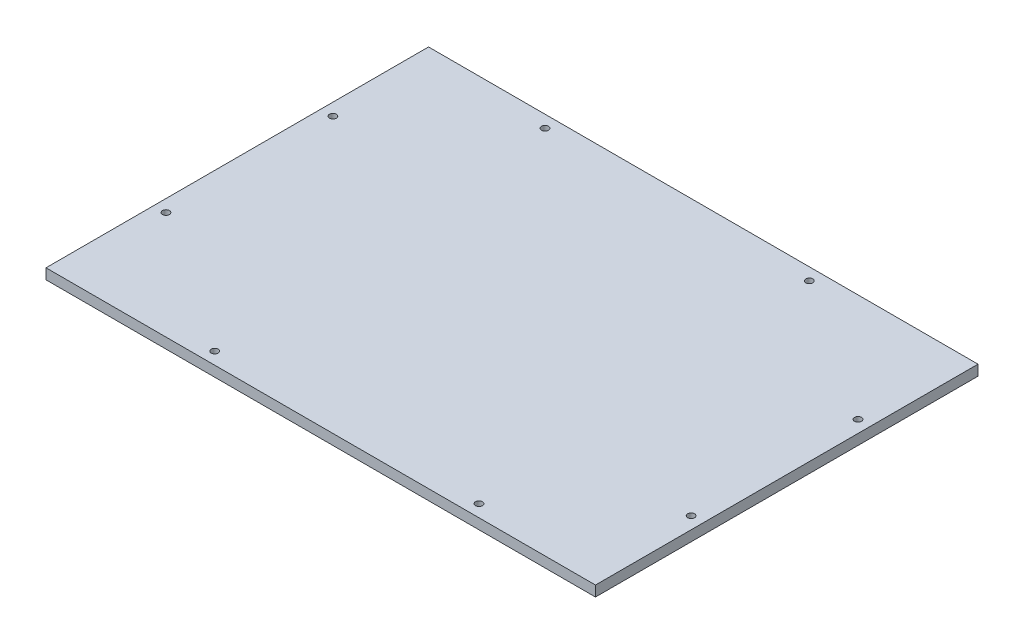
ISO-10303-21;
HEADER;
FILE_DESCRIPTION(('STEP AP214'),'2;1');
FILE_NAME('part.step','',(''),(''),'','','');
FILE_SCHEMA(('AUTOMOTIVE_DESIGN { 1 0 10303 214 1 1 1 1 }'));
ENDSEC;
DATA;
#1=APPLICATION_CONTEXT('core data for automotive mechanical design processes');
#2=APPLICATION_PROTOCOL_DEFINITION('international standard','automotive_design',2000,#1);
#3=PRODUCT_CONTEXT('',#1,'mechanical');
#4=PRODUCT('Part','Part','',(#3));
#5=PRODUCT_RELATED_PRODUCT_CATEGORY('part','',(#4));
#6=PRODUCT_DEFINITION_FORMATION('','',#4);
#7=PRODUCT_DEFINITION_CONTEXT('part definition',#1,'design');
#8=PRODUCT_DEFINITION('design','',#6,#7);
#9=PRODUCT_DEFINITION_SHAPE('','',#8);
#10=(LENGTH_UNIT() NAMED_UNIT(*) SI_UNIT(.MILLI.,.METRE.));
#11=(NAMED_UNIT(*) PLANE_ANGLE_UNIT() SI_UNIT($,.RADIAN.));
#12=(NAMED_UNIT(*) SI_UNIT($,.STERADIAN.) SOLID_ANGLE_UNIT());
#13=UNCERTAINTY_MEASURE_WITH_UNIT(LENGTH_MEASURE(1.E-05),#10,'distance_accuracy_value','');
#14=(GEOMETRIC_REPRESENTATION_CONTEXT(3) GLOBAL_UNCERTAINTY_ASSIGNED_CONTEXT((#13)) GLOBAL_UNIT_ASSIGNED_CONTEXT((#10,
#11,#12)) REPRESENTATION_CONTEXT('',''));
#15=CARTESIAN_POINT('',(0.,0.,0.));
#16=DIRECTION('',(0.,0.,1.));
#17=DIRECTION('',(1.,0.,0.));
#18=AXIS2_PLACEMENT_3D('',#15,#16,#17);
#19=CARTESIAN_POINT('',(8.4882527000098,9.525,0.));
#20=DIRECTION('',(1.,0.,0.));
#21=DIRECTION('',(0.,0.,-1.));
#22=AXIS2_PLACEMENT_3D('',#19,#20,#21);
#23=PLANE('',#22);
#24=DIRECTION('',(0.,0.,1.));
#25=VECTOR('',#24,1.);
#26=CARTESIAN_POINT('',(8.4882527000098,0.,0.));
#27=LINE('',#26,#25);
#28=CARTESIAN_POINT('',(8.4882527000098,0.,0.));
#29=VERTEX_POINT('',#28);
#30=CARTESIAN_POINT('',(8.48825270000984,0.,349.25));
#31=VERTEX_POINT('',#30);
#32=EDGE_CURVE('E95',#29,#31,#27,.T.);
#33=ORIENTED_EDGE('',*,*,#32,.T.);
#34=DIRECTION('',(0.,-1.,0.));
#35=VECTOR('',#34,1.);
#36=CARTESIAN_POINT('',(8.48825270000984,9.525,349.25));
#37=LINE('',#36,#35);
#38=CARTESIAN_POINT('',(8.48825270000984,9.525,349.25));
#39=VERTEX_POINT('',#38);
#40=EDGE_CURVE('E11',#39,#31,#37,.T.);
#41=ORIENTED_EDGE('',*,*,#40,.F.);
#42=DIRECTION('',(0.,0.,1.));
#43=VECTOR('',#42,1.);
#44=CARTESIAN_POINT('',(8.4882527000098,9.525,0.));
#45=LINE('',#44,#43);
#46=CARTESIAN_POINT('',(8.4882527000098,9.525,0.));
#47=VERTEX_POINT('',#46);
#48=EDGE_CURVE('E83',#47,#39,#45,.T.);
#49=ORIENTED_EDGE('',*,*,#48,.F.);
#50=DIRECTION('',(0.,-1.,0.));
#51=VECTOR('',#50,1.);
#52=CARTESIAN_POINT('',(8.4882527000098,9.525,0.));
#53=LINE('',#52,#51);
#54=EDGE_CURVE('E91',#47,#29,#53,.T.);
#55=ORIENTED_EDGE('',*,*,#54,.T.);
#56=EDGE_LOOP('',(#33,#41,#49,#55));
#57=FACE_BOUND('',#56,.T.);
#58=ADVANCED_FACE('F32',(#57),#23,.F.);
#59=CARTESIAN_POINT('',(8.48825270000984,9.525,349.25));
#60=DIRECTION('',(0.,0.,-1.));
#61=DIRECTION('',(-1.,0.,0.));
#62=AXIS2_PLACEMENT_3D('',#59,#60,#61);
#63=PLANE('',#62);
#64=DIRECTION('',(1.,0.,0.));
#65=VECTOR('',#64,1.);
#66=CARTESIAN_POINT('',(8.48825270000984,0.,349.25));
#67=LINE('',#66,#65);
#68=CARTESIAN_POINT('',(510.13825270001,0.,349.25));
#69=VERTEX_POINT('',#68);
#70=EDGE_CURVE('E87',#31,#69,#67,.T.);
#71=ORIENTED_EDGE('',*,*,#70,.T.);
#72=DIRECTION('',(0.,-1.,0.));
#73=VECTOR('',#72,1.);
#74=CARTESIAN_POINT('',(510.13825270001,9.525,349.25));
#75=LINE('',#74,#73);
#76=CARTESIAN_POINT('',(510.13825270001,9.525,349.25));
#77=VERTEX_POINT('',#76);
#78=EDGE_CURVE('E40',#77,#69,#75,.T.);
#79=ORIENTED_EDGE('',*,*,#78,.F.);
#80=DIRECTION('',(1.,0.,0.));
#81=VECTOR('',#80,1.);
#82=CARTESIAN_POINT('',(8.48825270000984,9.525,349.25));
#83=LINE('',#82,#81);
#84=EDGE_CURVE('E78',#39,#77,#83,.T.);
#85=ORIENTED_EDGE('',*,*,#84,.F.);
#86=ORIENTED_EDGE('',*,*,#40,.T.);
#87=EDGE_LOOP('',(#71,#79,#85,#86));
#88=FACE_BOUND('',#87,.T.);
#89=ADVANCED_FACE('F86',(#88),#63,.F.);
#90=CARTESIAN_POINT('',(510.13825270001,9.525,0.));
#91=DIRECTION('',(-1.,0.,0.));
#92=DIRECTION('',(0.,0.,1.));
#93=AXIS2_PLACEMENT_3D('',#90,#91,#92);
#94=PLANE('',#93);
#95=DIRECTION('',(0.,0.,-1.));
#96=VECTOR('',#95,1.);
#97=CARTESIAN_POINT('',(510.13825270001,0.,0.));
#98=LINE('',#97,#96);
#99=CARTESIAN_POINT('',(510.13825270001,0.,0.));
#100=VERTEX_POINT('',#99);
#101=EDGE_CURVE('E65',#69,#100,#98,.T.);
#102=ORIENTED_EDGE('',*,*,#101,.T.);
#103=DIRECTION('',(0.,-1.,0.));
#104=VECTOR('',#103,1.);
#105=CARTESIAN_POINT('',(510.13825270001,9.525,0.));
#106=LINE('',#105,#104);
#107=CARTESIAN_POINT('',(510.13825270001,9.525,0.));
#108=VERTEX_POINT('',#107);
#109=EDGE_CURVE('E88',#108,#100,#106,.T.);
#110=ORIENTED_EDGE('',*,*,#109,.F.);
#111=DIRECTION('',(0.,0.,-1.));
#112=VECTOR('',#111,1.);
#113=CARTESIAN_POINT('',(510.13825270001,9.525,0.));
#114=LINE('',#113,#112);
#115=EDGE_CURVE('E81',#77,#108,#114,.T.);
#116=ORIENTED_EDGE('',*,*,#115,.F.);
#117=ORIENTED_EDGE('',*,*,#78,.T.);
#118=EDGE_LOOP('',(#102,#110,#116,#117));
#119=FACE_BOUND('',#118,.T.);
#120=ADVANCED_FACE('F89',(#119),#94,.F.);
#121=CARTESIAN_POINT('',(8.4882527000098,9.525,0.));
#122=DIRECTION('',(0.,0.,1.));
#123=DIRECTION('',(1.,0.,0.));
#124=AXIS2_PLACEMENT_3D('',#121,#122,#123);
#125=PLANE('',#124);
#126=DIRECTION('',(-1.,0.,0.));
#127=VECTOR('',#126,1.);
#128=CARTESIAN_POINT('',(8.4882527000098,0.,0.));
#129=LINE('',#128,#127);
#130=EDGE_CURVE('E71',#100,#29,#129,.T.);
#131=ORIENTED_EDGE('',*,*,#130,.T.);
#132=ORIENTED_EDGE('',*,*,#54,.F.);
#133=DIRECTION('',(-1.,0.,0.));
#134=VECTOR('',#133,1.);
#135=CARTESIAN_POINT('',(8.4882527000098,9.525,0.));
#136=LINE('',#135,#134);
#137=EDGE_CURVE('E48',#108,#47,#136,.T.);
#138=ORIENTED_EDGE('',*,*,#137,.F.);
#139=ORIENTED_EDGE('',*,*,#109,.T.);
#140=EDGE_LOOP('',(#131,#132,#138,#139));
#141=FACE_BOUND('',#140,.T.);
#142=ADVANCED_FACE('F103',(#141),#125,.F.);
#143=CARTESIAN_POINT('',(0.,9.525,0.));
#144=DIRECTION('',(0.,1.,0.));
#145=DIRECTION('',(0.,0.,1.));
#146=AXIS2_PLACEMENT_3D('',#143,#144,#145);
#147=PLANE('',#146);
#148=CARTESIAN_POINT('',(499.02575270001,9.525,98.4250000000003));
#149=DIRECTION('',(0.,1.,0.));
#150=DIRECTION('',(0.,0.,1.));
#151=AXIS2_PLACEMENT_3D('',#148,#149,#150);
#152=CIRCLE('',#151,3.17500000000014);
#153=CARTESIAN_POINT('',(499.02575270001,9.525,101.6));
#154=VERTEX_POINT('',#153);
#155=EDGE_CURVE('E137',#154,#154,#152,.T.);
#156=ORIENTED_EDGE('',*,*,#155,.F.);
#157=EDGE_LOOP('',(#156));
#158=FACE_BOUND('',#157,.T.);
#159=CARTESIAN_POINT('',(499.025752700008,9.525,250.825));
#160=DIRECTION('',(0.,1.,0.));
#161=DIRECTION('',(0.,0.,1.));
#162=AXIS2_PLACEMENT_3D('',#159,#160,#161);
#163=CIRCLE('',#162,3.17499999999997);
#164=CARTESIAN_POINT('',(499.025752700008,9.525,254.));
#165=VERTEX_POINT('',#164);
#166=EDGE_CURVE('E136',#165,#165,#163,.T.);
#167=ORIENTED_EDGE('',*,*,#166,.F.);
#168=EDGE_LOOP('',(#167));
#169=FACE_BOUND('',#168,.T.);
#170=CARTESIAN_POINT('',(19.6007527000113,9.525,98.4249999999999));
#171=DIRECTION('',(0.,1.,0.));
#172=DIRECTION('',(0.,0.,1.));
#173=AXIS2_PLACEMENT_3D('',#170,#171,#172);
#174=CIRCLE('',#173,3.17500000000001);
#175=CARTESIAN_POINT('',(19.6007527000113,9.525,101.6));
#176=VERTEX_POINT('',#175);
#177=EDGE_CURVE('E143',#176,#176,#174,.T.);
#178=ORIENTED_EDGE('',*,*,#177,.F.);
#179=EDGE_LOOP('',(#178));
#180=FACE_BOUND('',#179,.T.);
#181=CARTESIAN_POINT('',(19.6007527000118,9.525,250.825));
#182=DIRECTION('',(0.,1.,0.));
#183=DIRECTION('',(0.,0.,1.));
#184=AXIS2_PLACEMENT_3D('',#181,#182,#183);
#185=CIRCLE('',#184,3.17500000000003);
#186=CARTESIAN_POINT('',(19.6007527000118,9.525,254.));
#187=VERTEX_POINT('',#186);
#188=EDGE_CURVE('E149',#187,#187,#185,.T.);
#189=ORIENTED_EDGE('',*,*,#188,.F.);
#190=EDGE_LOOP('',(#189));
#191=FACE_BOUND('',#190,.T.);
#192=CARTESIAN_POINT('',(125.963252700011,9.525,11.1125000000004));
#193=DIRECTION('',(0.,1.,0.));
#194=DIRECTION('',(0.,0.,1.));
#195=AXIS2_PLACEMENT_3D('',#192,#193,#194);
#196=CIRCLE('',#195,3.17499999999997);
#197=CARTESIAN_POINT('',(125.963252700011,9.525,14.2875000000004));
#198=VERTEX_POINT('',#197);
#199=EDGE_CURVE('E119',#198,#198,#196,.T.);
#200=ORIENTED_EDGE('',*,*,#199,.F.);
#201=EDGE_LOOP('',(#200));
#202=FACE_BOUND('',#201,.T.);
#203=CARTESIAN_POINT('',(367.263252700011,9.525,11.1125000000004));
#204=DIRECTION('',(0.,1.,0.));
#205=DIRECTION('',(0.,0.,1.));
#206=AXIS2_PLACEMENT_3D('',#203,#204,#205);
#207=CIRCLE('',#206,3.17499999999997);
#208=CARTESIAN_POINT('',(367.263252700011,9.525,14.2875000000004));
#209=VERTEX_POINT('',#208);
#210=EDGE_CURVE('E118',#209,#209,#207,.T.);
#211=ORIENTED_EDGE('',*,*,#210,.F.);
#212=EDGE_LOOP('',(#211));
#213=FACE_BOUND('',#212,.T.);
#214=CARTESIAN_POINT('',(151.363252700012,9.525,338.137499999998));
#215=DIRECTION('',(0.,1.,0.));
#216=DIRECTION('',(0.,0.,1.));
#217=AXIS2_PLACEMENT_3D('',#214,#215,#216);
#218=CIRCLE('',#217,3.175);
#219=CARTESIAN_POINT('',(151.363252700012,9.525,341.312499999998));
#220=VERTEX_POINT('',#219);
#221=EDGE_CURVE('E126',#220,#220,#218,.T.);
#222=ORIENTED_EDGE('',*,*,#221,.F.);
#223=EDGE_LOOP('',(#222));
#224=FACE_BOUND('',#223,.T.);
#225=CARTESIAN_POINT('',(392.663252700012,9.525,338.137499999995));
#226=DIRECTION('',(0.,1.,0.));
#227=DIRECTION('',(0.,0.,1.));
#228=AXIS2_PLACEMENT_3D('',#225,#226,#227);
#229=CIRCLE('',#228,3.17499999999997);
#230=CARTESIAN_POINT('',(392.663252700012,9.525,341.312499999995));
#231=VERTEX_POINT('',#230);
#232=EDGE_CURVE('E111',#231,#231,#229,.T.);
#233=ORIENTED_EDGE('',*,*,#232,.F.);
#234=EDGE_LOOP('',(#233));
#235=FACE_BOUND('',#234,.T.);
#236=ORIENTED_EDGE('',*,*,#48,.T.);
#237=ORIENTED_EDGE('',*,*,#84,.T.);
#238=ORIENTED_EDGE('',*,*,#115,.T.);
#239=ORIENTED_EDGE('',*,*,#137,.T.);
#240=EDGE_LOOP('',(#236,#237,#238,#239));
#241=FACE_BOUND('',#240,.T.);
#242=ADVANCED_FACE('F79',(#158,#169,#180,#191,#202,#213,#224,#235,#241),#147,.T.);
#243=CARTESIAN_POINT('',(0.,0.,0.));
#244=DIRECTION('',(0.,1.,0.));
#245=DIRECTION('',(0.,0.,1.));
#246=AXIS2_PLACEMENT_3D('',#243,#244,#245);
#247=PLANE('',#246);
#248=CARTESIAN_POINT('',(499.02575270001,0.,98.4250000000003));
#249=DIRECTION('',(0.,1.,0.));
#250=DIRECTION('',(0.,0.,1.));
#251=AXIS2_PLACEMENT_3D('',#248,#249,#250);
#252=CIRCLE('',#251,3.17500000000014);
#253=CARTESIAN_POINT('',(499.02575270001,0.,101.6));
#254=VERTEX_POINT('',#253);
#255=EDGE_CURVE('E133',#254,#254,#252,.F.);
#256=ORIENTED_EDGE('',*,*,#255,.F.);
#257=EDGE_LOOP('',(#256));
#258=FACE_BOUND('',#257,.T.);
#259=CARTESIAN_POINT('',(499.025752700008,0.,250.825));
#260=DIRECTION('',(0.,1.,0.));
#261=DIRECTION('',(0.,0.,1.));
#262=AXIS2_PLACEMENT_3D('',#259,#260,#261);
#263=CIRCLE('',#262,3.17499999999997);
#264=CARTESIAN_POINT('',(499.025752700008,0.,254.));
#265=VERTEX_POINT('',#264);
#266=EDGE_CURVE('E140',#265,#265,#263,.F.);
#267=ORIENTED_EDGE('',*,*,#266,.F.);
#268=EDGE_LOOP('',(#267));
#269=FACE_BOUND('',#268,.T.);
#270=CARTESIAN_POINT('',(19.6007527000113,0.,98.4249999999999));
#271=DIRECTION('',(0.,1.,0.));
#272=DIRECTION('',(0.,0.,1.));
#273=AXIS2_PLACEMENT_3D('',#270,#271,#272);
#274=CIRCLE('',#273,3.17500000000001);
#275=CARTESIAN_POINT('',(19.6007527000113,0.,101.6));
#276=VERTEX_POINT('',#275);
#277=EDGE_CURVE('E146',#276,#276,#274,.F.);
#278=ORIENTED_EDGE('',*,*,#277,.F.);
#279=EDGE_LOOP('',(#278));
#280=FACE_BOUND('',#279,.T.);
#281=CARTESIAN_POINT('',(19.6007527000118,0.,250.825));
#282=DIRECTION('',(0.,1.,0.));
#283=DIRECTION('',(0.,0.,1.));
#284=AXIS2_PLACEMENT_3D('',#281,#282,#283);
#285=CIRCLE('',#284,3.17500000000003);
#286=CARTESIAN_POINT('',(19.6007527000118,0.,254.));
#287=VERTEX_POINT('',#286);
#288=EDGE_CURVE('E122',#287,#287,#285,.F.);
#289=ORIENTED_EDGE('',*,*,#288,.F.);
#290=EDGE_LOOP('',(#289));
#291=FACE_BOUND('',#290,.T.);
#292=CARTESIAN_POINT('',(125.963252700011,0.,11.1125000000004));
#293=DIRECTION('',(0.,1.,0.));
#294=DIRECTION('',(0.,0.,1.));
#295=AXIS2_PLACEMENT_3D('',#292,#293,#294);
#296=CIRCLE('',#295,3.17499999999997);
#297=CARTESIAN_POINT('',(125.963252700011,0.,14.2875000000004));
#298=VERTEX_POINT('',#297);
#299=EDGE_CURVE('E115',#298,#298,#296,.F.);
#300=ORIENTED_EDGE('',*,*,#299,.F.);
#301=EDGE_LOOP('',(#300));
#302=FACE_BOUND('',#301,.T.);
#303=CARTESIAN_POINT('',(367.263252700011,0.,11.1125000000004));
#304=DIRECTION('',(0.,1.,0.));
#305=DIRECTION('',(0.,0.,1.));
#306=AXIS2_PLACEMENT_3D('',#303,#304,#305);
#307=CIRCLE('',#306,3.17499999999997);
#308=CARTESIAN_POINT('',(367.263252700011,0.,14.2875000000004));
#309=VERTEX_POINT('',#308);
#310=EDGE_CURVE('E123',#309,#309,#307,.F.);
#311=ORIENTED_EDGE('',*,*,#310,.F.);
#312=EDGE_LOOP('',(#311));
#313=FACE_BOUND('',#312,.T.);
#314=CARTESIAN_POINT('',(151.363252700012,0.,338.137499999998));
#315=DIRECTION('',(0.,1.,0.));
#316=DIRECTION('',(0.,0.,1.));
#317=AXIS2_PLACEMENT_3D('',#314,#315,#316);
#318=CIRCLE('',#317,3.175);
#319=CARTESIAN_POINT('',(151.363252700012,0.,341.312499999998));
#320=VERTEX_POINT('',#319);
#321=EDGE_CURVE('E114',#320,#320,#318,.F.);
#322=ORIENTED_EDGE('',*,*,#321,.F.);
#323=EDGE_LOOP('',(#322));
#324=FACE_BOUND('',#323,.T.);
#325=CARTESIAN_POINT('',(392.663252700012,0.,338.137499999995));
#326=DIRECTION('',(0.,1.,0.));
#327=DIRECTION('',(0.,0.,1.));
#328=AXIS2_PLACEMENT_3D('',#325,#326,#327);
#329=CIRCLE('',#328,3.17499999999997);
#330=CARTESIAN_POINT('',(392.663252700012,0.,341.312499999995));
#331=VERTEX_POINT('',#330);
#332=EDGE_CURVE('E98',#331,#331,#329,.F.);
#333=ORIENTED_EDGE('',*,*,#332,.F.);
#334=EDGE_LOOP('',(#333));
#335=FACE_BOUND('',#334,.T.);
#336=ORIENTED_EDGE('',*,*,#32,.F.);
#337=ORIENTED_EDGE('',*,*,#130,.F.);
#338=ORIENTED_EDGE('',*,*,#101,.F.);
#339=ORIENTED_EDGE('',*,*,#70,.F.);
#340=EDGE_LOOP('',(#336,#337,#338,#339));
#341=FACE_BOUND('',#340,.T.);
#342=ADVANCED_FACE('F106',(#258,#269,#280,#291,#302,#313,#324,#335,#341),#247,.F.);
#343=CARTESIAN_POINT('',(392.663252700012,-8.98025612106952,338.137499999995));
#344=DIRECTION('',(0.,1.,0.));
#345=DIRECTION('',(0.,0.,1.));
#346=AXIS2_PLACEMENT_3D('',#343,#344,#345);
#347=CYLINDRICAL_SURFACE('',#346,3.17499999999997);
#348=ORIENTED_EDGE('',*,*,#332,.T.);
#349=EDGE_LOOP('',(#348));
#350=FACE_BOUND('',#349,.T.);
#351=ORIENTED_EDGE('',*,*,#232,.T.);
#352=EDGE_LOOP('',(#351));
#353=FACE_BOUND('',#352,.T.);
#354=ADVANCED_FACE('F171',(#350,#353),#347,.F.);
#355=CARTESIAN_POINT('',(151.363252700012,-8.98025612106952,338.137499999998));
#356=DIRECTION('',(0.,1.,0.));
#357=DIRECTION('',(0.,0.,1.));
#358=AXIS2_PLACEMENT_3D('',#355,#356,#357);
#359=CYLINDRICAL_SURFACE('',#358,3.175);
#360=ORIENTED_EDGE('',*,*,#321,.T.);
#361=EDGE_LOOP('',(#360));
#362=FACE_BOUND('',#361,.T.);
#363=ORIENTED_EDGE('',*,*,#221,.T.);
#364=EDGE_LOOP('',(#363));
#365=FACE_BOUND('',#364,.T.);
#366=ADVANCED_FACE('F173',(#362,#365),#359,.F.);
#367=CARTESIAN_POINT('',(367.263252700011,-8.98025612106952,11.1125000000004));
#368=DIRECTION('',(0.,1.,0.));
#369=DIRECTION('',(0.,0.,1.));
#370=AXIS2_PLACEMENT_3D('',#367,#368,#369);
#371=CYLINDRICAL_SURFACE('',#370,3.17499999999997);
#372=ORIENTED_EDGE('',*,*,#310,.T.);
#373=EDGE_LOOP('',(#372));
#374=FACE_BOUND('',#373,.T.);
#375=ORIENTED_EDGE('',*,*,#210,.T.);
#376=EDGE_LOOP('',(#375));
#377=FACE_BOUND('',#376,.T.);
#378=ADVANCED_FACE('F180',(#374,#377),#371,.F.);
#379=CARTESIAN_POINT('',(125.963252700011,-8.98025612106952,11.1125000000004));
#380=DIRECTION('',(0.,1.,0.));
#381=DIRECTION('',(0.,0.,1.));
#382=AXIS2_PLACEMENT_3D('',#379,#380,#381);
#383=CYLINDRICAL_SURFACE('',#382,3.17499999999997);
#384=ORIENTED_EDGE('',*,*,#299,.T.);
#385=EDGE_LOOP('',(#384));
#386=FACE_BOUND('',#385,.T.);
#387=ORIENTED_EDGE('',*,*,#199,.T.);
#388=EDGE_LOOP('',(#387));
#389=FACE_BOUND('',#388,.T.);
#390=ADVANCED_FACE('F227',(#386,#389),#383,.F.);
#391=CARTESIAN_POINT('',(19.6007527000118,-8.98025612106952,250.825));
#392=DIRECTION('',(0.,1.,0.));
#393=DIRECTION('',(0.,0.,1.));
#394=AXIS2_PLACEMENT_3D('',#391,#392,#393);
#395=CYLINDRICAL_SURFACE('',#394,3.17500000000003);
#396=ORIENTED_EDGE('',*,*,#288,.T.);
#397=EDGE_LOOP('',(#396));
#398=FACE_BOUND('',#397,.T.);
#399=ORIENTED_EDGE('',*,*,#188,.T.);
#400=EDGE_LOOP('',(#399));
#401=FACE_BOUND('',#400,.T.);
#402=ADVANCED_FACE('F157',(#398,#401),#395,.F.);
#403=CARTESIAN_POINT('',(19.6007527000113,-8.98025612106952,98.4249999999999));
#404=DIRECTION('',(0.,1.,0.));
#405=DIRECTION('',(0.,0.,1.));
#406=AXIS2_PLACEMENT_3D('',#403,#404,#405);
#407=CYLINDRICAL_SURFACE('',#406,3.17500000000001);
#408=ORIENTED_EDGE('',*,*,#277,.T.);
#409=EDGE_LOOP('',(#408));
#410=FACE_BOUND('',#409,.T.);
#411=ORIENTED_EDGE('',*,*,#177,.T.);
#412=EDGE_LOOP('',(#411));
#413=FACE_BOUND('',#412,.T.);
#414=ADVANCED_FACE('F245',(#410,#413),#407,.F.);
#415=CARTESIAN_POINT('',(499.025752700008,-8.98025612106952,250.825));
#416=DIRECTION('',(0.,1.,0.));
#417=DIRECTION('',(0.,0.,1.));
#418=AXIS2_PLACEMENT_3D('',#415,#416,#417);
#419=CYLINDRICAL_SURFACE('',#418,3.17499999999997);
#420=ORIENTED_EDGE('',*,*,#266,.T.);
#421=EDGE_LOOP('',(#420));
#422=FACE_BOUND('',#421,.T.);
#423=ORIENTED_EDGE('',*,*,#166,.T.);
#424=EDGE_LOOP('',(#423));
#425=FACE_BOUND('',#424,.T.);
#426=ADVANCED_FACE('F255',(#422,#425),#419,.F.);
#427=CARTESIAN_POINT('',(499.02575270001,-8.98025612106952,98.4250000000003));
#428=DIRECTION('',(0.,1.,0.));
#429=DIRECTION('',(0.,0.,1.));
#430=AXIS2_PLACEMENT_3D('',#427,#428,#429);
#431=CYLINDRICAL_SURFACE('',#430,3.17500000000014);
#432=ORIENTED_EDGE('',*,*,#255,.T.);
#433=EDGE_LOOP('',(#432));
#434=FACE_BOUND('',#433,.T.);
#435=ORIENTED_EDGE('',*,*,#155,.T.);
#436=EDGE_LOOP('',(#435));
#437=FACE_BOUND('',#436,.T.);
#438=ADVANCED_FACE('F265',(#434,#437),#431,.F.);
#439=CLOSED_SHELL('',(#58,#89,#120,#142,#242,#342,#354,#366,#378,#390,#402,#414,#426,#438));
#440=MANIFOLD_SOLID_BREP('B2',#439);
#441=ADVANCED_BREP_SHAPE_REPRESENTATION('',(#18,#440),#14);
#442=SHAPE_DEFINITION_REPRESENTATION(#9,#441);
ENDSEC;
END-ISO-10303-21;
